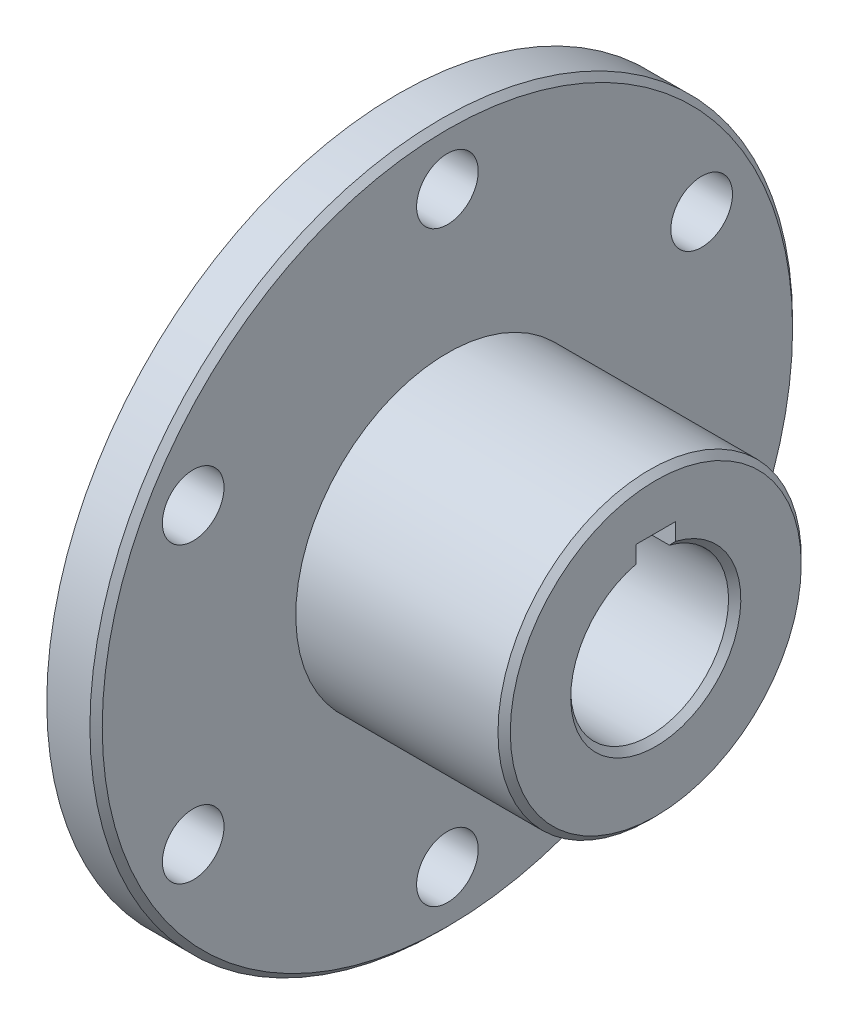
ISO-10303-21;
HEADER;
FILE_DESCRIPTION(('STEP AP214'),'2;1');
FILE_NAME('part.step','',(''),(''),'','','');
FILE_SCHEMA(('AUTOMOTIVE_DESIGN { 1 0 10303 214 1 1 1 1 }'));
ENDSEC;
DATA;
#1=APPLICATION_CONTEXT('core data for automotive mechanical design processes');
#2=APPLICATION_PROTOCOL_DEFINITION('international standard','automotive_design',2000,#1);
#3=PRODUCT_CONTEXT('',#1,'mechanical');
#4=PRODUCT('Part','Part','',(#3));
#5=PRODUCT_RELATED_PRODUCT_CATEGORY('part','',(#4));
#6=PRODUCT_DEFINITION_FORMATION('','',#4);
#7=PRODUCT_DEFINITION_CONTEXT('part definition',#1,'design');
#8=PRODUCT_DEFINITION('design','',#6,#7);
#9=PRODUCT_DEFINITION_SHAPE('','',#8);
#10=(LENGTH_UNIT() NAMED_UNIT(*) SI_UNIT(.MILLI.,.METRE.));
#11=(NAMED_UNIT(*) PLANE_ANGLE_UNIT() SI_UNIT($,.RADIAN.));
#12=(NAMED_UNIT(*) SI_UNIT($,.STERADIAN.) SOLID_ANGLE_UNIT());
#13=UNCERTAINTY_MEASURE_WITH_UNIT(LENGTH_MEASURE(1.E-05),#10,'distance_accuracy_value','');
#14=(GEOMETRIC_REPRESENTATION_CONTEXT(3) GLOBAL_UNCERTAINTY_ASSIGNED_CONTEXT((#13)) GLOBAL_UNIT_ASSIGNED_CONTEXT((#10,
#11,#12)) REPRESENTATION_CONTEXT('',''));
#15=CARTESIAN_POINT('',(0.,0.,0.));
#16=DIRECTION('',(0.,0.,1.));
#17=DIRECTION('',(1.,0.,0.));
#18=AXIS2_PLACEMENT_3D('',#15,#16,#17);
#19=CARTESIAN_POINT('',(20.4,0.,0.));
#20=DIRECTION('',(1.,0.,0.));
#21=DIRECTION('',(0.,1.,0.));
#22=AXIS2_PLACEMENT_3D('',#19,#20,#21);
#23=CONICAL_SURFACE('',#22,6.4,0.785398163397448);
#24=CARTESIAN_POINT('',(20.8999999998302,6.71192967763596,1.60000000003938));
#25=CARTESIAN_POINT('',(20.8784498389392,6.68977567135454,1.60000000410243));
#26=CARTESIAN_POINT('',(20.8569026309934,6.6676187925185,1.60000007103659));
#27=CARTESIAN_POINT('',(20.8140122274536,6.62350271673312,1.60000025635978));
#28=CARTESIAN_POINT('',(20.7926689762767,6.60154357382233,1.60000037427042));
#29=CARTESIAN_POINT('',(20.7501864853077,6.55782297212791,1.60000058901808));
#30=CARTESIAN_POINT('',(20.7290471889023,6.53606156835482,1.60000068604036));
#31=CARTESIAN_POINT('',(20.6869726090698,6.49273644164535,1.60000081966956));
#32=CARTESIAN_POINT('',(20.6660372679314,6.47117277475465,1.60000085683341));
#33=CARTESIAN_POINT('',(20.6243705995468,6.4282431158944,1.60000085666634));
#34=CARTESIAN_POINT('',(20.6036392134514,6.40687718104293,1.60000082003589));
#35=CARTESIAN_POINT('',(20.5623804565242,6.36434297649297,1.60000068627588));
#36=CARTESIAN_POINT('',(20.5418530256522,6.34317476503451,1.60000058972665));
#37=CARTESIAN_POINT('',(20.5010021796811,6.30103599473039,1.60000037470887));
#38=CARTESIAN_POINT('',(20.4806787033075,6.28006549528684,1.60000025646033));
#39=CARTESIAN_POINT('',(20.4402357700941,6.2383221296721,1.60000007212753));
#40=CARTESIAN_POINT('',(20.4201162506599,6.21754932414505,1.60000000554732));
#41=CARTESIAN_POINT('',(20.399999999783,6.196773353726,1.59999999992925));
#42=B_SPLINE_CURVE_WITH_KNOTS('',3,(#24,#25,#26,#27,#28,#29,#30,#31,#32,#33,#34,#35,#36,#37,#38,
#39,#40,#41),.UNSPECIFIED.,.F.,.F.,(4,2,2,2,2,2,2,2,4),(0.,0.0927193875436508,0.18458692666341,
0.27560262147421,0.365766482992098,0.455078529475184,0.54353878677446,0.631147288695252,
0.717904077370095),.UNSPECIFIED.);
#43=CARTESIAN_POINT('',(20.3999999998915,6.19677335410668,1.59999999888892));
#44=VERTEX_POINT('',#43);
#45=CARTESIAN_POINT('',(20.8999999999151,6.71192967714706,1.60000000245649));
#46=VERTEX_POINT('',#45);
#47=EDGE_CURVE('E104',#44,#46,#42,.F.);
#48=ORIENTED_EDGE('',*,*,#47,.T.);
#49=CARTESIAN_POINT('',(20.8999999999999,0.,0.));
#50=DIRECTION('',(1.,0.,0.));
#51=DIRECTION('',(0.,1.,0.));
#52=AXIS2_PLACEMENT_3D('',#49,#50,#51);
#53=CIRCLE('',#52,6.89999999999992);
#54=CARTESIAN_POINT('',(20.899999999915,6.71192967714702,-1.60000000245649));
#55=VERTEX_POINT('',#54);
#56=EDGE_CURVE('E20',#46,#55,#53,.T.);
#57=ORIENTED_EDGE('',*,*,#56,.T.);
#58=CARTESIAN_POINT('',(20.399999999783,6.196773353726,-1.59999999992925));
#59=CARTESIAN_POINT('',(20.42011625066,6.21754932414505,-1.60000000554732));
#60=CARTESIAN_POINT('',(20.4402357700941,6.2383221296721,-1.60000007212753));
#61=CARTESIAN_POINT('',(20.4806787033075,6.28006549528683,-1.60000025646033));
#62=CARTESIAN_POINT('',(20.5010021796811,6.30103599473038,-1.60000037470887));
#63=CARTESIAN_POINT('',(20.5418530256522,6.3431747650345,-1.60000058972665));
#64=CARTESIAN_POINT('',(20.5623804565242,6.36434297649296,-1.60000068627588));
#65=CARTESIAN_POINT('',(20.6036392134514,6.40687718104291,-1.60000082003589));
#66=CARTESIAN_POINT('',(20.6243705995467,6.42824311589439,-1.60000085666634));
#67=CARTESIAN_POINT('',(20.6660372679314,6.47117277475464,-1.60000085683341));
#68=CARTESIAN_POINT('',(20.6869726090698,6.49273644164534,-1.60000081966956));
#69=CARTESIAN_POINT('',(20.7290471889023,6.53606156835481,-1.60000068604036));
#70=CARTESIAN_POINT('',(20.7501864853077,6.5578229721279,-1.60000058901808));
#71=CARTESIAN_POINT('',(20.7926689762767,6.60154357382232,-1.60000037427042));
#72=CARTESIAN_POINT('',(20.8140122274536,6.62350271673312,-1.60000025635978));
#73=CARTESIAN_POINT('',(20.8569026309934,6.6676187925185,-1.60000007103659));
#74=CARTESIAN_POINT('',(20.8784498389392,6.68977567135454,-1.60000000410243));
#75=CARTESIAN_POINT('',(20.8999999998302,6.71192967763596,-1.60000000003938));
#76=B_SPLINE_CURVE_WITH_KNOTS('',3,(#58,#59,#60,#61,#62,#63,#64,#65,#66,#67,#68,#69,#70,#71,#72,
#73,#74,#75),.UNSPECIFIED.,.F.,.F.,(4,2,2,2,2,2,2,2,4),(0.,0.0867567886748334,0.17436529059562,
0.26282554789489,0.352137594377973,0.442301455895862,0.533317150706667,0.625184689826431,
0.71790407737009),.UNSPECIFIED.);
#77=CARTESIAN_POINT('',(20.3999999998915,6.19677335377852,-1.6000000001599));
#78=VERTEX_POINT('',#77);
#79=EDGE_CURVE('E65',#55,#78,#76,.F.);
#80=ORIENTED_EDGE('',*,*,#79,.T.);
#81=CARTESIAN_POINT('',(20.4,0.,0.));
#82=DIRECTION('',(-1.,0.,0.));
#83=DIRECTION('',(0.,0.,1.));
#84=AXIS2_PLACEMENT_3D('',#81,#82,#83);
#85=CIRCLE('',#84,6.4);
#86=EDGE_CURVE('E72',#44,#78,#85,.F.);
#87=ORIENTED_EDGE('',*,*,#86,.F.);
#88=EDGE_LOOP('',(#48,#57,#80,#87));
#89=FACE_BOUND('',#88,.T.);
#90=ADVANCED_FACE('F16',(#89),#23,.F.);
#91=CARTESIAN_POINT('',(20.9,6.196773354,-1.6));
#92=DIRECTION('',(0.,0.,-1.));
#93=DIRECTION('',(-1.,0.,0.));
#94=AXIS2_PLACEMENT_3D('',#91,#92,#93);
#95=PLANE('',#94);
#96=CARTESIAN_POINT('',(1.69825958851177E-10,6.71192967763596,-1.60000000003938));
#97=CARTESIAN_POINT('',(0.0215501610607805,6.68977567135454,-1.60000000410242));
#98=CARTESIAN_POINT('',(0.0430973690065822,6.6676187925185,-1.60000007103658));
#99=CARTESIAN_POINT('',(0.0859877725463635,6.62350271673312,-1.60000025635977));
#100=CARTESIAN_POINT('',(0.107331023723299,6.60154357382233,-1.60000037427042));
#101=CARTESIAN_POINT('',(0.149813514692262,6.55782297212791,-1.60000058901808));
#102=CARTESIAN_POINT('',(0.170952811097665,6.53606156835482,-1.60000068604036));
#103=CARTESIAN_POINT('',(0.213027390930223,6.49273644164535,-1.60000081966955));
#104=CARTESIAN_POINT('',(0.23396273206859,6.47117277475465,-1.60000085683341));
#105=CARTESIAN_POINT('',(0.275629400453239,6.4282431158944,-1.60000085666634));
#106=CARTESIAN_POINT('',(0.296360786548623,6.40687718104293,-1.60000082003589));
#107=CARTESIAN_POINT('',(0.337619543475815,6.36434297649297,-1.60000068627588));
#108=CARTESIAN_POINT('',(0.358146974347763,6.34317476503451,-1.60000058972665));
#109=CARTESIAN_POINT('',(0.398997820318901,6.30103599473038,-1.60000037470887));
#110=CARTESIAN_POINT('',(0.4193212966925,6.28006549528684,-1.60000025646033));
#111=CARTESIAN_POINT('',(0.459764229905892,6.2383221296721,-1.60000007212753));
#112=CARTESIAN_POINT('',(0.479883749340045,6.21754932414504,-1.60000000554732));
#113=CARTESIAN_POINT('',(0.500000000217017,6.196773353726,-1.59999999992925));
#114=B_SPLINE_CURVE_WITH_KNOTS('',3,(#96,#97,#98,#99,#100,#101,#102,#103,#104,#105,#106,#107,
#108,#109,#110,#111,#112,#113),.UNSPECIFIED.,.F.,.F.,(4,2,2,2,2,2,2,2,4),(0.,0.0927193875436497,
0.184586926663408,0.275602621474208,0.365766482992097,0.455078529475182,0.543538786774458,
0.63114728869525,0.717904077370093),.UNSPECIFIED.);
#115=CARTESIAN_POINT('',(0.500000000108481,6.19677335377851,-1.6000000001599));
#116=VERTEX_POINT('',#115);
#117=CARTESIAN_POINT('',(0.,6.71192967765552,-1.6000000006897));
#118=VERTEX_POINT('',#117);
#119=EDGE_CURVE('E82',#116,#118,#114,.F.);
#120=ORIENTED_EDGE('',*,*,#119,.F.);
#121=DIRECTION('',(1.,0.,0.));
#122=VECTOR('',#121,1.);
#123=CARTESIAN_POINT('',(10.45,6.19677335383103,-1.60000000039055));
#124=LINE('',#123,#122);
#125=EDGE_CURVE('E75',#78,#116,#124,.F.);
#126=ORIENTED_EDGE('',*,*,#125,.F.);
#127=ORIENTED_EDGE('',*,*,#79,.F.);
#128=DIRECTION('',(0.,1.,0.));
#129=VECTOR('',#128,1.);
#130=CARTESIAN_POINT('',(20.9,0.,-1.6000000048736));
#131=LINE('',#130,#129);
#132=CARTESIAN_POINT('',(20.9,8.1000000097456,-1.6000000048736));
#133=VERTEX_POINT('',#132);
#134=EDGE_CURVE('E87',#55,#133,#131,.T.);
#135=ORIENTED_EDGE('',*,*,#134,.T.);
#136=DIRECTION('',(-1.,0.,0.));
#137=VECTOR('',#136,1.);
#138=CARTESIAN_POINT('',(10.45,8.1,-1.6));
#139=LINE('',#138,#137);
#140=CARTESIAN_POINT('',(0.,8.100000009388,-1.60000000236267));
#141=VERTEX_POINT('',#140);
#142=EDGE_CURVE('E112',#133,#141,#139,.T.);
#143=ORIENTED_EDGE('',*,*,#142,.T.);
#144=DIRECTION('',(0.,1.,0.));
#145=VECTOR('',#144,1.);
#146=CARTESIAN_POINT('',(0.,7.148386677,-1.6));
#147=LINE('',#146,#145);
#148=EDGE_CURVE('E35',#118,#141,#147,.T.);
#149=ORIENTED_EDGE('',*,*,#148,.F.);
#150=EDGE_LOOP('',(#120,#126,#127,#135,#143,#149));
#151=FACE_BOUND('',#150,.T.);
#152=ADVANCED_FACE('F85',(#151),#95,.F.);
#153=CARTESIAN_POINT('',(0.,8.1,1.6));
#154=DIRECTION('',(0.,0.,1.));
#155=DIRECTION('',(0.,-1.,0.));
#156=AXIS2_PLACEMENT_3D('',#153,#154,#155);
#157=PLANE('',#156);
#158=CARTESIAN_POINT('',(0.500000000217015,6.196773353726,1.59999999992925));
#159=CARTESIAN_POINT('',(0.479883749340043,6.21754932414505,1.60000000554732));
#160=CARTESIAN_POINT('',(0.45976422990589,6.2383221296721,1.60000007212753));
#161=CARTESIAN_POINT('',(0.419321296692497,6.28006549528684,1.60000025646033));
#162=CARTESIAN_POINT('',(0.398997820318898,6.30103599473039,1.60000037470887));
#163=CARTESIAN_POINT('',(0.35814697434776,6.34317476503451,1.60000058972665));
#164=CARTESIAN_POINT('',(0.337619543475812,6.36434297649297,1.60000068627588));
#165=CARTESIAN_POINT('',(0.29636078654862,6.40687718104293,1.60000082003589));
#166=CARTESIAN_POINT('',(0.275629400453236,6.42824311589441,1.60000085666634));
#167=CARTESIAN_POINT('',(0.233962732068587,6.47117277475466,1.60000085683341));
#168=CARTESIAN_POINT('',(0.21302739093022,6.49273644164536,1.60000081966956));
#169=CARTESIAN_POINT('',(0.170952811097663,6.53606156835482,1.60000068604036));
#170=CARTESIAN_POINT('',(0.14981351469226,6.55782297212791,1.60000058901808));
#171=CARTESIAN_POINT('',(0.107331023723297,6.60154357382233,1.60000037427042));
#172=CARTESIAN_POINT('',(0.0859877725463619,6.62350271673312,1.60000025635978));
#173=CARTESIAN_POINT('',(0.043097369006581,6.6676187925185,1.60000007103658));
#174=CARTESIAN_POINT('',(0.0215501610607795,6.68977567135454,1.60000000410242));
#175=CARTESIAN_POINT('',(1.69825958851177E-10,6.71192967763596,1.60000000003938));
#176=B_SPLINE_CURVE_WITH_KNOTS('',3,(#158,#159,#160,#161,#162,#163,#164,#165,#166,#167,#168,
#169,#170,#171,#172,#173,#174,#175),.UNSPECIFIED.,.F.,.F.,(4,2,2,2,2,2,2,2,4),(0.,
0.0867567886748446,0.174365290595637,0.262825547894914,0.352137594377999,0.442301455895886,
0.533317150706685,0.625184689826442,0.717904077370091),.UNSPECIFIED.);
#177=CARTESIAN_POINT('',(8.49129794255887E-11,6.71192967772795,1.60000000001969));
#178=VERTEX_POINT('',#177);
#179=CARTESIAN_POINT('',(0.50000000010848,6.19677335410668,1.59999999888892));
#180=VERTEX_POINT('',#179);
#181=EDGE_CURVE('E98',#178,#180,#176,.F.);
#182=ORIENTED_EDGE('',*,*,#181,.F.);
#183=DIRECTION('',(0.,-1.,0.));
#184=VECTOR('',#183,1.);
#185=CARTESIAN_POINT('',(0.,7.148386677,1.6));
#186=LINE('',#185,#184);
#187=CARTESIAN_POINT('',(0.,8.1,1.6));
#188=VERTEX_POINT('',#187);
#189=EDGE_CURVE('E101',#188,#178,#186,.T.);
#190=ORIENTED_EDGE('',*,*,#189,.F.);
#191=DIRECTION('',(1.,0.,0.));
#192=VECTOR('',#191,1.);
#193=CARTESIAN_POINT('',(10.45,8.1,1.6));
#194=LINE('',#193,#192);
#195=CARTESIAN_POINT('',(20.9,8.1000000048728,1.600000003046));
#196=VERTEX_POINT('',#195);
#197=EDGE_CURVE('E114',#188,#196,#194,.T.);
#198=ORIENTED_EDGE('',*,*,#197,.T.);
#199=DIRECTION('',(0.,-1.,0.));
#200=VECTOR('',#199,1.);
#201=CARTESIAN_POINT('',(20.9,0.,1.6000000048736));
#202=LINE('',#201,#200);
#203=EDGE_CURVE('E95',#196,#46,#202,.T.);
#204=ORIENTED_EDGE('',*,*,#203,.T.);
#205=ORIENTED_EDGE('',*,*,#47,.F.);
#206=DIRECTION('',(-1.,0.,0.));
#207=VECTOR('',#206,1.);
#208=CARTESIAN_POINT('',(10.45,6.19677335448736,1.59999999784859));
#209=LINE('',#208,#207);
#210=EDGE_CURVE('E77',#180,#44,#209,.F.);
#211=ORIENTED_EDGE('',*,*,#210,.F.);
#212=EDGE_LOOP('',(#182,#190,#198,#204,#205,#211));
#213=FACE_BOUND('',#212,.T.);
#214=ADVANCED_FACE('F174',(#213),#157,.F.);
#215=CARTESIAN_POINT('',(20.9,-11.9416,-11.9416));
#216=DIRECTION('',(-1.,0.,0.));
#217=DIRECTION('',(0.,0.,1.));
#218=AXIS2_PLACEMENT_3D('',#215,#216,#217);
#219=PLANE('',#218);
#220=ORIENTED_EDGE('',*,*,#56,.F.);
#221=ORIENTED_EDGE('',*,*,#203,.F.);
#222=DIRECTION('',(0.,0.,-1.));
#223=VECTOR('',#222,1.);
#224=CARTESIAN_POINT('',(20.9,8.1,0.));
#225=LINE('',#224,#223);
#226=EDGE_CURVE('E118',#196,#133,#225,.T.);
#227=ORIENTED_EDGE('',*,*,#226,.T.);
#228=ORIENTED_EDGE('',*,*,#134,.F.);
#229=EDGE_LOOP('',(#220,#221,#227,#228));
#230=FACE_BOUND('',#229,.T.);
#231=CARTESIAN_POINT('',(20.9,0.,0.));
#232=DIRECTION('',(-1.,0.,0.));
#233=DIRECTION('',(0.,0.,1.));
#234=AXIS2_PLACEMENT_3D('',#231,#232,#233);
#235=CIRCLE('',#234,11.8);
#236=CARTESIAN_POINT('',(20.9,0.,11.8));
#237=VERTEX_POINT('',#236);
#238=EDGE_CURVE('E115',#237,#237,#235,.F.);
#239=ORIENTED_EDGE('',*,*,#238,.T.);
#240=EDGE_LOOP('',(#239));
#241=FACE_BOUND('',#240,.T.);
#242=ADVANCED_FACE('F177',(#230,#241),#219,.F.);
#243=CARTESIAN_POINT('',(20.4,0.,0.));
#244=DIRECTION('',(-1.,0.,0.));
#245=DIRECTION('',(0.,-1.,0.));
#246=AXIS2_PLACEMENT_3D('',#243,#244,#245);
#247=CYLINDRICAL_SURFACE('',#246,6.4);
#248=CARTESIAN_POINT('',(0.499999999999945,0.,0.));
#249=DIRECTION('',(-1.,0.,0.));
#250=DIRECTION('',(0.,0.,1.));
#251=AXIS2_PLACEMENT_3D('',#248,#249,#250);
#252=CIRCLE('',#251,6.4);
#253=EDGE_CURVE('E121',#180,#116,#252,.F.);
#254=ORIENTED_EDGE('',*,*,#253,.F.);
#255=ORIENTED_EDGE('',*,*,#210,.T.);
#256=ORIENTED_EDGE('',*,*,#86,.T.);
#257=ORIENTED_EDGE('',*,*,#125,.T.);
#258=EDGE_LOOP('',(#254,#255,#256,#257));
#259=FACE_BOUND('',#258,.T.);
#260=ADVANCED_FACE('F74',(#259),#247,.F.);
#261=CARTESIAN_POINT('',(20.9,0.,0.));
#262=DIRECTION('',(-1.,0.,0.));
#263=DIRECTION('',(0.,0.,1.));
#264=AXIS2_PLACEMENT_3D('',#261,#262,#263);
#265=CONICAL_SURFACE('',#264,11.8,0.785398163397447);
#266=CARTESIAN_POINT('',(20.4,0.,0.));
#267=DIRECTION('',(-1.,0.,0.));
#268=DIRECTION('',(0.,0.,1.));
#269=AXIS2_PLACEMENT_3D('',#266,#267,#268);
#270=CIRCLE('',#269,12.3);
#271=CARTESIAN_POINT('',(20.4,0.,12.3));
#272=VERTEX_POINT('',#271);
#273=EDGE_CURVE('E262',#272,#272,#270,.F.);
#274=ORIENTED_EDGE('',*,*,#273,.T.);
#275=EDGE_LOOP('',(#274));
#276=FACE_BOUND('',#275,.T.);
#277=ORIENTED_EDGE('',*,*,#238,.F.);
#278=EDGE_LOOP('',(#277));
#279=FACE_BOUND('',#278,.T.);
#280=ADVANCED_FACE('F267',(#276,#279),#265,.T.);
#281=CARTESIAN_POINT('',(3.5,0.,0.));
#282=DIRECTION('',(-1.,0.,0.));
#283=DIRECTION('',(0.,-1.,0.));
#284=AXIS2_PLACEMENT_3D('',#281,#282,#283);
#285=CYLINDRICAL_SURFACE('',#284,28.5);
#286=CARTESIAN_POINT('',(0.,0.,0.));
#287=DIRECTION('',(-1.,0.,0.));
#288=DIRECTION('',(0.,-1.,0.));
#289=AXIS2_PLACEMENT_3D('',#286,#287,#288);
#290=CIRCLE('',#289,28.5);
#291=CARTESIAN_POINT('',(0.,-28.5,0.));
#292=VERTEX_POINT('',#291);
#293=EDGE_CURVE('E260',#292,#292,#290,.F.);
#294=ORIENTED_EDGE('',*,*,#293,.T.);
#295=EDGE_LOOP('',(#294));
#296=FACE_BOUND('',#295,.T.);
#297=CARTESIAN_POINT('',(3.50000000000006,0.,0.));
#298=DIRECTION('',(-1.,0.,0.));
#299=DIRECTION('',(0.,0.,1.));
#300=AXIS2_PLACEMENT_3D('',#297,#298,#299);
#301=CIRCLE('',#300,28.5);
#302=CARTESIAN_POINT('',(3.5,0.,28.5));
#303=VERTEX_POINT('',#302);
#304=EDGE_CURVE('E278',#303,#303,#301,.T.);
#305=ORIENTED_EDGE('',*,*,#304,.T.);
#306=EDGE_LOOP('',(#305));
#307=FACE_BOUND('',#306,.T.);
#308=ADVANCED_FACE('F147',(#296,#307),#285,.T.);
#309=CARTESIAN_POINT('',(0.,8.1,-1.6));
#310=DIRECTION('',(0.,1.,0.));
#311=DIRECTION('',(0.,0.,1.));
#312=AXIS2_PLACEMENT_3D('',#309,#310,#311);
#313=PLANE('',#312);
#314=ORIENTED_EDGE('',*,*,#197,.F.);
#315=DIRECTION('',(0.,0.,-1.));
#316=VECTOR('',#315,1.);
#317=CARTESIAN_POINT('',(0.,8.100000028164,0.));
#318=LINE('',#317,#316);
#319=EDGE_CURVE('E131',#188,#141,#318,.T.);
#320=ORIENTED_EDGE('',*,*,#319,.T.);
#321=ORIENTED_EDGE('',*,*,#142,.F.);
#322=ORIENTED_EDGE('',*,*,#226,.F.);
#323=EDGE_LOOP('',(#314,#320,#321,#322));
#324=FACE_BOUND('',#323,.T.);
#325=ADVANCED_FACE('F144',(#324),#313,.F.);
#326=CARTESIAN_POINT('',(0.5,0.,0.));
#327=DIRECTION('',(-1.,0.,0.));
#328=DIRECTION('',(0.,0.,1.));
#329=AXIS2_PLACEMENT_3D('',#326,#327,#328);
#330=CONICAL_SURFACE('',#329,6.4,0.785398163397449);
#331=CARTESIAN_POINT('',(0.,0.,0.));
#332=DIRECTION('',(-1.,0.,0.));
#333=DIRECTION('',(0.,0.,1.));
#334=AXIS2_PLACEMENT_3D('',#331,#332,#333);
#335=CIRCLE('',#334,6.9);
#336=EDGE_CURVE('E241',#118,#178,#335,.T.);
#337=ORIENTED_EDGE('',*,*,#336,.T.);
#338=ORIENTED_EDGE('',*,*,#181,.T.);
#339=ORIENTED_EDGE('',*,*,#253,.T.);
#340=ORIENTED_EDGE('',*,*,#119,.T.);
#341=EDGE_LOOP('',(#337,#338,#339,#340));
#342=FACE_BOUND('',#341,.T.);
#343=ADVANCED_FACE('F133',(#342),#330,.F.);
#344=CARTESIAN_POINT('',(4.,0.,0.));
#345=DIRECTION('',(-1.,0.,0.));
#346=DIRECTION('',(0.,0.,1.));
#347=AXIS2_PLACEMENT_3D('',#344,#345,#346);
#348=CONICAL_SURFACE('',#347,28.,0.785398163397449);
#349=CARTESIAN_POINT('',(4.,0.,0.));
#350=DIRECTION('',(-1.,0.,0.));
#351=DIRECTION('',(0.,0.,1.));
#352=AXIS2_PLACEMENT_3D('',#349,#350,#351);
#353=CIRCLE('',#352,28.);
#354=CARTESIAN_POINT('',(4.,0.,28.));
#355=VERTEX_POINT('',#354);
#356=EDGE_CURVE('E235',#355,#355,#353,.T.);
#357=ORIENTED_EDGE('',*,*,#356,.T.);
#358=EDGE_LOOP('',(#357));
#359=FACE_BOUND('',#358,.T.);
#360=ORIENTED_EDGE('',*,*,#304,.F.);
#361=EDGE_LOOP('',(#360));
#362=FACE_BOUND('',#361,.T.);
#363=ADVANCED_FACE('F143',(#359,#362),#348,.T.);
#364=CARTESIAN_POINT('',(0.,-11.90625,20.622229928));
#365=DIRECTION('',(1.,0.,0.));
#366=DIRECTION('',(0.,0.,-1.));
#367=AXIS2_PLACEMENT_3D('',#364,#365,#366);
#368=CYLINDRICAL_SURFACE('',#367,2.49999999960068);
#369=CARTESIAN_POINT('',(0.,-11.90625,20.622229928));
#370=DIRECTION('',(1.,0.,0.));
#371=DIRECTION('',(0.,0.,-1.));
#372=AXIS2_PLACEMENT_3D('',#369,#370,#371);
#373=CIRCLE('',#372,2.49999999960068);
#374=CARTESIAN_POINT('',(0.,-11.90625,18.1222299283993));
#375=VERTEX_POINT('',#374);
#376=EDGE_CURVE('E229',#375,#375,#373,.F.);
#377=ORIENTED_EDGE('',*,*,#376,.T.);
#378=EDGE_LOOP('',(#377));
#379=FACE_BOUND('',#378,.T.);
#380=CARTESIAN_POINT('',(4.,-11.90625,20.622229928));
#381=DIRECTION('',(1.,0.,0.));
#382=DIRECTION('',(0.,0.,-1.));
#383=AXIS2_PLACEMENT_3D('',#380,#381,#382);
#384=CIRCLE('',#383,2.49999999960068);
#385=CARTESIAN_POINT('',(4.,-11.90625,18.1222299283993));
#386=VERTEX_POINT('',#385);
#387=EDGE_CURVE('E232',#386,#386,#384,.T.);
#388=ORIENTED_EDGE('',*,*,#387,.T.);
#389=EDGE_LOOP('',(#388));
#390=FACE_BOUND('',#389,.T.);
#391=ADVANCED_FACE('F218',(#379,#390),#368,.F.);
#392=CARTESIAN_POINT('',(0.,-23.8125,0.));
#393=DIRECTION('',(1.,0.,0.));
#394=DIRECTION('',(0.,0.,-1.));
#395=AXIS2_PLACEMENT_3D('',#392,#393,#394);
#396=CYLINDRICAL_SURFACE('',#395,2.5);
#397=CARTESIAN_POINT('',(0.,-23.8125,0.));
#398=DIRECTION('',(1.,0.,0.));
#399=DIRECTION('',(0.,0.,-1.));
#400=AXIS2_PLACEMENT_3D('',#397,#398,#399);
#401=CIRCLE('',#400,2.5);
#402=CARTESIAN_POINT('',(0.,-23.8125,-2.5));
#403=VERTEX_POINT('',#402);
#404=EDGE_CURVE('E256',#403,#403,#401,.F.);
#405=ORIENTED_EDGE('',*,*,#404,.T.);
#406=EDGE_LOOP('',(#405));
#407=FACE_BOUND('',#406,.T.);
#408=CARTESIAN_POINT('',(4.,-23.8125,0.));
#409=DIRECTION('',(1.,0.,0.));
#410=DIRECTION('',(0.,0.,-1.));
#411=AXIS2_PLACEMENT_3D('',#408,#409,#410);
#412=CIRCLE('',#411,2.5);
#413=CARTESIAN_POINT('',(4.,-23.8125,-2.5));
#414=VERTEX_POINT('',#413);
#415=EDGE_CURVE('E234',#414,#414,#412,.T.);
#416=ORIENTED_EDGE('',*,*,#415,.T.);
#417=EDGE_LOOP('',(#416));
#418=FACE_BOUND('',#417,.T.);
#419=ADVANCED_FACE('F215',(#407,#418),#396,.F.);
#420=CARTESIAN_POINT('',(0.,-11.90625,-20.622229928));
#421=DIRECTION('',(1.,0.,0.));
#422=DIRECTION('',(0.,0.,-1.));
#423=AXIS2_PLACEMENT_3D('',#420,#421,#422);
#424=CYLINDRICAL_SURFACE('',#423,2.49999999960068);
#425=CARTESIAN_POINT('',(0.,-11.90625,-20.622229928));
#426=DIRECTION('',(1.,0.,0.));
#427=DIRECTION('',(0.,0.,-1.));
#428=AXIS2_PLACEMENT_3D('',#425,#426,#427);
#429=CIRCLE('',#428,2.49999999960068);
#430=CARTESIAN_POINT('',(0.,-11.90625,-23.1222299276007));
#431=VERTEX_POINT('',#430);
#432=EDGE_CURVE('E253',#431,#431,#429,.F.);
#433=ORIENTED_EDGE('',*,*,#432,.T.);
#434=EDGE_LOOP('',(#433));
#435=FACE_BOUND('',#434,.T.);
#436=CARTESIAN_POINT('',(4.,-11.90625,-20.622229928));
#437=DIRECTION('',(1.,0.,0.));
#438=DIRECTION('',(0.,0.,-1.));
#439=AXIS2_PLACEMENT_3D('',#436,#437,#438);
#440=CIRCLE('',#439,2.49999999960068);
#441=CARTESIAN_POINT('',(4.,-11.90625,-23.1222299276007));
#442=VERTEX_POINT('',#441);
#443=EDGE_CURVE('E238',#442,#442,#440,.T.);
#444=ORIENTED_EDGE('',*,*,#443,.T.);
#445=EDGE_LOOP('',(#444));
#446=FACE_BOUND('',#445,.T.);
#447=ADVANCED_FACE('F211',(#435,#446),#424,.F.);
#448=CARTESIAN_POINT('',(0.,11.90625,-20.622229928));
#449=DIRECTION('',(1.,0.,0.));
#450=DIRECTION('',(0.,0.,-1.));
#451=AXIS2_PLACEMENT_3D('',#448,#449,#450);
#452=CYLINDRICAL_SURFACE('',#451,2.49999999960068);
#453=CARTESIAN_POINT('',(0.,11.90625,-20.622229928));
#454=DIRECTION('',(1.,0.,0.));
#455=DIRECTION('',(0.,0.,-1.));
#456=AXIS2_PLACEMENT_3D('',#453,#454,#455);
#457=CIRCLE('',#456,2.49999999960068);
#458=CARTESIAN_POINT('',(0.,11.90625,-23.1222299276007));
#459=VERTEX_POINT('',#458);
#460=EDGE_CURVE('E250',#459,#459,#457,.F.);
#461=ORIENTED_EDGE('',*,*,#460,.T.);
#462=EDGE_LOOP('',(#461));
#463=FACE_BOUND('',#462,.T.);
#464=CARTESIAN_POINT('',(4.,11.90625,-20.622229928));
#465=DIRECTION('',(1.,0.,0.));
#466=DIRECTION('',(0.,0.,-1.));
#467=AXIS2_PLACEMENT_3D('',#464,#465,#466);
#468=CIRCLE('',#467,2.49999999960068);
#469=CARTESIAN_POINT('',(4.,11.90625,-23.1222299276007));
#470=VERTEX_POINT('',#469);
#471=EDGE_CURVE('E422',#470,#470,#468,.T.);
#472=ORIENTED_EDGE('',*,*,#471,.T.);
#473=EDGE_LOOP('',(#472));
#474=FACE_BOUND('',#473,.T.);
#475=ADVANCED_FACE('F207',(#463,#474),#452,.F.);
#476=CARTESIAN_POINT('',(0.,23.8125,0.));
#477=DIRECTION('',(1.,0.,0.));
#478=DIRECTION('',(0.,0.,-1.));
#479=AXIS2_PLACEMENT_3D('',#476,#477,#478);
#480=CYLINDRICAL_SURFACE('',#479,2.5);
#481=CARTESIAN_POINT('',(0.,23.8125,0.));
#482=DIRECTION('',(1.,0.,0.));
#483=DIRECTION('',(0.,0.,-1.));
#484=AXIS2_PLACEMENT_3D('',#481,#482,#483);
#485=CIRCLE('',#484,2.5);
#486=CARTESIAN_POINT('',(0.,23.8125,-2.5));
#487=VERTEX_POINT('',#486);
#488=EDGE_CURVE('E247',#487,#487,#485,.F.);
#489=ORIENTED_EDGE('',*,*,#488,.T.);
#490=EDGE_LOOP('',(#489));
#491=FACE_BOUND('',#490,.T.);
#492=CARTESIAN_POINT('',(4.,23.8125,0.));
#493=DIRECTION('',(1.,0.,0.));
#494=DIRECTION('',(0.,0.,-1.));
#495=AXIS2_PLACEMENT_3D('',#492,#493,#494);
#496=CIRCLE('',#495,2.5);
#497=CARTESIAN_POINT('',(4.,23.8125,-2.5));
#498=VERTEX_POINT('',#497);
#499=EDGE_CURVE('E417',#498,#498,#496,.T.);
#500=ORIENTED_EDGE('',*,*,#499,.T.);
#501=EDGE_LOOP('',(#500));
#502=FACE_BOUND('',#501,.T.);
#503=ADVANCED_FACE('F194',(#491,#502),#480,.F.);
#504=CARTESIAN_POINT('',(20.4,0.,0.));
#505=DIRECTION('',(-1.,0.,0.));
#506=DIRECTION('',(0.,-1.,0.));
#507=AXIS2_PLACEMENT_3D('',#504,#505,#506);
#508=CYLINDRICAL_SURFACE('',#507,12.3);
#509=CARTESIAN_POINT('',(4.,0.,0.));
#510=DIRECTION('',(-1.,0.,0.));
#511=DIRECTION('',(0.,-1.,0.));
#512=AXIS2_PLACEMENT_3D('',#509,#510,#511);
#513=CIRCLE('',#512,12.3);
#514=CARTESIAN_POINT('',(4.,-12.3,0.));
#515=VERTEX_POINT('',#514);
#516=EDGE_CURVE('E415',#515,#515,#513,.F.);
#517=ORIENTED_EDGE('',*,*,#516,.T.);
#518=EDGE_LOOP('',(#517));
#519=FACE_BOUND('',#518,.T.);
#520=ORIENTED_EDGE('',*,*,#273,.F.);
#521=EDGE_LOOP('',(#520));
#522=FACE_BOUND('',#521,.T.);
#523=ADVANCED_FACE('F186',(#519,#522),#508,.T.);
#524=CARTESIAN_POINT('',(0.,-28.842,28.842));
#525=DIRECTION('',(1.,0.,0.));
#526=DIRECTION('',(0.,0.,-1.));
#527=AXIS2_PLACEMENT_3D('',#524,#525,#526);
#528=PLANE('',#527);
#529=ORIENTED_EDGE('',*,*,#336,.F.);
#530=ORIENTED_EDGE('',*,*,#148,.T.);
#531=ORIENTED_EDGE('',*,*,#319,.F.);
#532=ORIENTED_EDGE('',*,*,#189,.T.);
#533=EDGE_LOOP('',(#529,#530,#531,#532));
#534=FACE_BOUND('',#533,.T.);
#535=ORIENTED_EDGE('',*,*,#488,.F.);
#536=EDGE_LOOP('',(#535));
#537=FACE_BOUND('',#536,.T.);
#538=ORIENTED_EDGE('',*,*,#460,.F.);
#539=EDGE_LOOP('',(#538));
#540=FACE_BOUND('',#539,.T.);
#541=ORIENTED_EDGE('',*,*,#432,.F.);
#542=EDGE_LOOP('',(#541));
#543=FACE_BOUND('',#542,.T.);
#544=ORIENTED_EDGE('',*,*,#404,.F.);
#545=EDGE_LOOP('',(#544));
#546=FACE_BOUND('',#545,.T.);
#547=ORIENTED_EDGE('',*,*,#376,.F.);
#548=EDGE_LOOP('',(#547));
#549=FACE_BOUND('',#548,.T.);
#550=CARTESIAN_POINT('',(0.,11.90625,20.622229928));
#551=DIRECTION('',(1.,0.,0.));
#552=DIRECTION('',(0.,0.,-1.));
#553=AXIS2_PLACEMENT_3D('',#550,#551,#552);
#554=CIRCLE('',#553,2.49999999960068);
#555=CARTESIAN_POINT('',(0.,11.90625,18.1222299283993));
#556=VERTEX_POINT('',#555);
#557=EDGE_CURVE('E26',#556,#556,#554,.F.);
#558=ORIENTED_EDGE('',*,*,#557,.F.);
#559=EDGE_LOOP('',(#558));
#560=FACE_BOUND('',#559,.T.);
#561=ORIENTED_EDGE('',*,*,#293,.F.);
#562=EDGE_LOOP('',(#561));
#563=FACE_BOUND('',#562,.T.);
#564=ADVANCED_FACE('F184',(#534,#537,#540,#543,#546,#549,#560,#563),#528,.F.);
#565=CARTESIAN_POINT('',(4.,-28.336,-28.336));
#566=DIRECTION('',(-1.,0.,0.));
#567=DIRECTION('',(0.,0.,1.));
#568=AXIS2_PLACEMENT_3D('',#565,#566,#567);
#569=PLANE('',#568);
#570=ORIENTED_EDGE('',*,*,#516,.F.);
#571=EDGE_LOOP('',(#570));
#572=FACE_BOUND('',#571,.T.);
#573=ORIENTED_EDGE('',*,*,#499,.F.);
#574=EDGE_LOOP('',(#573));
#575=FACE_BOUND('',#574,.T.);
#576=ORIENTED_EDGE('',*,*,#471,.F.);
#577=EDGE_LOOP('',(#576));
#578=FACE_BOUND('',#577,.T.);
#579=ORIENTED_EDGE('',*,*,#443,.F.);
#580=EDGE_LOOP('',(#579));
#581=FACE_BOUND('',#580,.T.);
#582=ORIENTED_EDGE('',*,*,#415,.F.);
#583=EDGE_LOOP('',(#582));
#584=FACE_BOUND('',#583,.T.);
#585=ORIENTED_EDGE('',*,*,#387,.F.);
#586=EDGE_LOOP('',(#585));
#587=FACE_BOUND('',#586,.T.);
#588=CARTESIAN_POINT('',(4.,11.90625,20.622229928));
#589=DIRECTION('',(1.,0.,0.));
#590=DIRECTION('',(0.,0.,-1.));
#591=AXIS2_PLACEMENT_3D('',#588,#589,#590);
#592=CIRCLE('',#591,2.49999999960068);
#593=CARTESIAN_POINT('',(4.,11.90625,18.1222299283993));
#594=VERTEX_POINT('',#593);
#595=EDGE_CURVE('E11',#594,#594,#592,.T.);
#596=ORIENTED_EDGE('',*,*,#595,.F.);
#597=EDGE_LOOP('',(#596));
#598=FACE_BOUND('',#597,.T.);
#599=ORIENTED_EDGE('',*,*,#356,.F.);
#600=EDGE_LOOP('',(#599));
#601=FACE_BOUND('',#600,.T.);
#602=ADVANCED_FACE('F18',(#572,#575,#578,#581,#584,#587,#598,#601),#569,.F.);
#603=CARTESIAN_POINT('',(0.,11.90625,20.622229928));
#604=DIRECTION('',(1.,0.,0.));
#605=DIRECTION('',(0.,0.,-1.));
#606=AXIS2_PLACEMENT_3D('',#603,#604,#605);
#607=CYLINDRICAL_SURFACE('',#606,2.49999999960068);
#608=ORIENTED_EDGE('',*,*,#595,.T.);
#609=EDGE_LOOP('',(#608));
#610=FACE_BOUND('',#609,.T.);
#611=ORIENTED_EDGE('',*,*,#557,.T.);
#612=EDGE_LOOP('',(#611));
#613=FACE_BOUND('',#612,.T.);
#614=ADVANCED_FACE('F192',(#610,#613),#607,.F.);
#615=CLOSED_SHELL('',(#90,#152,#214,#242,#260,#280,#308,#325,#343,#363,#391,#419,#447,#475,#503,
#523,#564,#602,#614));
#616=MANIFOLD_SOLID_BREP('B1',#615);
#617=ADVANCED_BREP_SHAPE_REPRESENTATION('',(#18,#616),#14);
#618=SHAPE_DEFINITION_REPRESENTATION(#9,#617);
ENDSEC;
END-ISO-10303-21;
